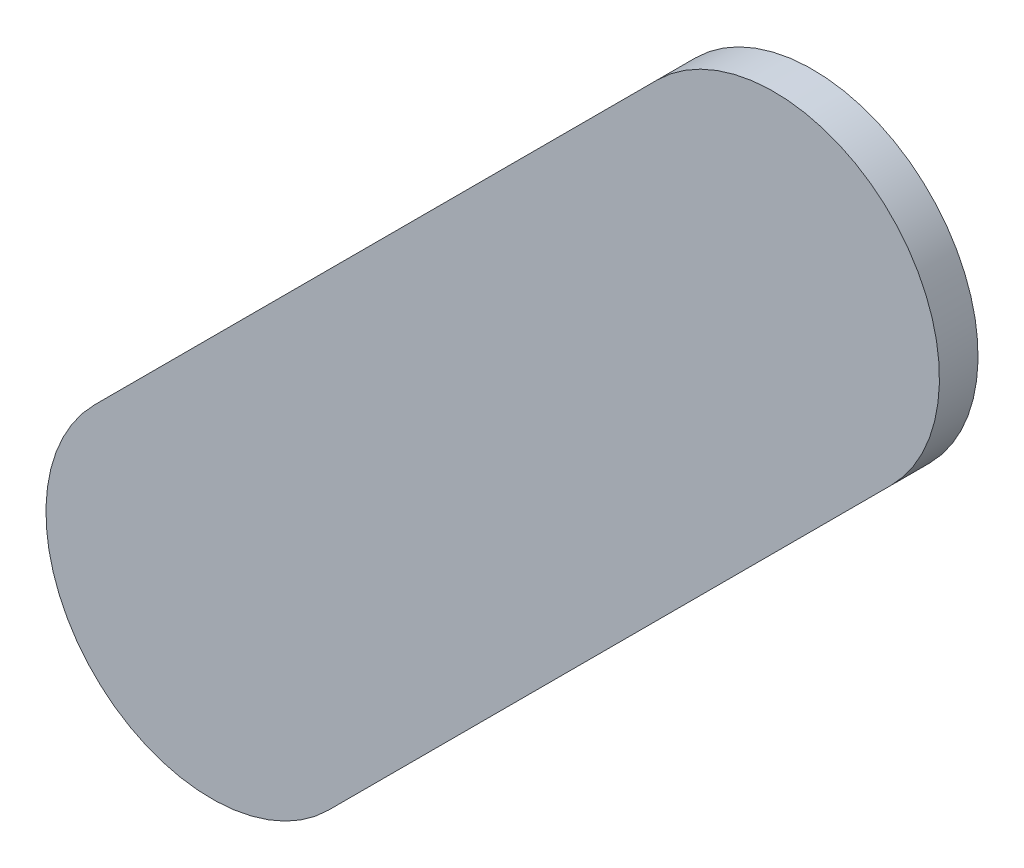
ISO-10303-21;
HEADER;
FILE_DESCRIPTION(('STEP AP214'),'2;1');
FILE_NAME('part.step','',(''),(''),'','','');
FILE_SCHEMA(('AUTOMOTIVE_DESIGN { 1 0 10303 214 1 1 1 1 }'));
ENDSEC;
DATA;
#1=APPLICATION_CONTEXT('core data for automotive mechanical design processes');
#2=APPLICATION_PROTOCOL_DEFINITION('international standard','automotive_design',2000,#1);
#3=PRODUCT_CONTEXT('',#1,'mechanical');
#4=PRODUCT('Part','Part','',(#3));
#5=PRODUCT_RELATED_PRODUCT_CATEGORY('part','',(#4));
#6=PRODUCT_DEFINITION_FORMATION('','',#4);
#7=PRODUCT_DEFINITION_CONTEXT('part definition',#1,'design');
#8=PRODUCT_DEFINITION('design','',#6,#7);
#9=PRODUCT_DEFINITION_SHAPE('','',#8);
#10=(LENGTH_UNIT() NAMED_UNIT(*) SI_UNIT(.MILLI.,.METRE.));
#11=(NAMED_UNIT(*) PLANE_ANGLE_UNIT() SI_UNIT($,.RADIAN.));
#12=(NAMED_UNIT(*) SI_UNIT($,.STERADIAN.) SOLID_ANGLE_UNIT());
#13=UNCERTAINTY_MEASURE_WITH_UNIT(LENGTH_MEASURE(1.E-05),#10,'distance_accuracy_value','');
#14=(GEOMETRIC_REPRESENTATION_CONTEXT(3) GLOBAL_UNCERTAINTY_ASSIGNED_CONTEXT((#13)) GLOBAL_UNIT_ASSIGNED_CONTEXT((#10,
#11,#12)) REPRESENTATION_CONTEXT('',''));
#15=CARTESIAN_POINT('',(0.,0.,0.));
#16=DIRECTION('',(0.,0.,1.));
#17=DIRECTION('',(1.,0.,0.));
#18=AXIS2_PLACEMENT_3D('',#15,#16,#17);
#19=CARTESIAN_POINT('',(126.393933,-71.403933,1.635));
#20=DIRECTION('',(0.,0.,1.));
#21=DIRECTION('',(1.,0.,0.));
#22=AXIS2_PLACEMENT_3D('',#19,#20,#21);
#23=PLANE('',#22);
#24=DIRECTION('',(-0.707106781186548,-0.707106781186548,0.));
#25=VECTOR('',#24,1.);
#26=CARTESIAN_POINT('',(126.393933,-71.403933,1.635));
#27=LINE('',#26,#25);
#28=CARTESIAN_POINT('',(126.393933,-71.403933,1.635));
#29=VERTEX_POINT('',#28);
#30=CARTESIAN_POINT('',(125.883933,-71.913933,1.635));
#31=VERTEX_POINT('',#30);
#32=EDGE_CURVE('E93',#29,#31,#27,.T.);
#33=ORIENTED_EDGE('',*,*,#32,.T.);
#34=CARTESIAN_POINT('',(125.9899995,-72.0199995,1.635));
#35=DIRECTION('',(0.,0.,1.));
#36=DIRECTION('',(-0.707106781186548,0.707106781186548,0.));
#37=AXIS2_PLACEMENT_3D('',#34,#35,#36);
#38=CIRCLE('',#37,0.150000682813);
#39=CARTESIAN_POINT('',(126.096066,-72.126066,1.635));
#40=VERTEX_POINT('',#39);
#41=EDGE_CURVE('E71',#31,#40,#38,.T.);
#42=ORIENTED_EDGE('',*,*,#41,.T.);
#43=DIRECTION('',(0.707106781186548,0.707106781186548,0.));
#44=VECTOR('',#43,1.);
#45=CARTESIAN_POINT('',(126.096066,-72.126066,1.635));
#46=LINE('',#45,#44);
#47=CARTESIAN_POINT('',(126.606066,-71.616066,1.635));
#48=VERTEX_POINT('',#47);
#49=EDGE_CURVE('E76',#40,#48,#46,.T.);
#50=ORIENTED_EDGE('',*,*,#49,.T.);
#51=CARTESIAN_POINT('',(126.4999995,-71.5099995,1.635));
#52=DIRECTION('',(0.,0.,1.));
#53=DIRECTION('',(0.707106781186548,-0.707106781186548,0.));
#54=AXIS2_PLACEMENT_3D('',#51,#52,#53);
#55=CIRCLE('',#54,0.150000682813);
#56=EDGE_CURVE('E11',#48,#29,#55,.T.);
#57=ORIENTED_EDGE('',*,*,#56,.T.);
#58=EDGE_LOOP('',(#33,#42,#50,#57));
#59=FACE_BOUND('',#58,.T.);
#60=ADVANCED_FACE('F17',(#59),#23,.T.);
#61=CARTESIAN_POINT('',(126.393933,-71.403933,1.6));
#62=DIRECTION('',(0.,0.,1.));
#63=DIRECTION('',(1.,0.,0.));
#64=AXIS2_PLACEMENT_3D('',#61,#62,#63);
#65=PLANE('',#64);
#66=CARTESIAN_POINT('',(126.4999995,-71.5099995,1.6));
#67=DIRECTION('',(0.,0.,1.));
#68=DIRECTION('',(0.707106781186548,-0.707106781186548,0.));
#69=AXIS2_PLACEMENT_3D('',#66,#67,#68);
#70=CIRCLE('',#69,0.150000682813);
#71=CARTESIAN_POINT('',(126.606066,-71.616066,1.6));
#72=VERTEX_POINT('',#71);
#73=CARTESIAN_POINT('',(126.393933,-71.403933,1.6));
#74=VERTEX_POINT('',#73);
#75=EDGE_CURVE('E25',#72,#74,#70,.T.);
#76=ORIENTED_EDGE('',*,*,#75,.F.);
#77=DIRECTION('',(0.707106781186548,0.707106781186548,0.));
#78=VECTOR('',#77,1.);
#79=CARTESIAN_POINT('',(126.096066,-72.126066,1.6));
#80=LINE('',#79,#78);
#81=CARTESIAN_POINT('',(126.096066,-72.126066,1.6));
#82=VERTEX_POINT('',#81);
#83=EDGE_CURVE('E60',#82,#72,#80,.T.);
#84=ORIENTED_EDGE('',*,*,#83,.F.);
#85=CARTESIAN_POINT('',(125.9899995,-72.0199995,1.6));
#86=DIRECTION('',(0.,0.,1.));
#87=DIRECTION('',(-0.707106781186548,0.707106781186548,0.));
#88=AXIS2_PLACEMENT_3D('',#85,#86,#87);
#89=CIRCLE('',#88,0.150000682813);
#90=CARTESIAN_POINT('',(125.883933,-71.913933,1.6));
#91=VERTEX_POINT('',#90);
#92=EDGE_CURVE('E65',#91,#82,#89,.T.);
#93=ORIENTED_EDGE('',*,*,#92,.F.);
#94=DIRECTION('',(-0.707106781186548,-0.707106781186548,0.));
#95=VECTOR('',#94,1.);
#96=CARTESIAN_POINT('',(126.393933,-71.403933,1.6));
#97=LINE('',#96,#95);
#98=EDGE_CURVE('E113',#74,#91,#97,.T.);
#99=ORIENTED_EDGE('',*,*,#98,.F.);
#100=EDGE_LOOP('',(#76,#84,#93,#99));
#101=FACE_BOUND('',#100,.T.);
#102=ADVANCED_FACE('F62',(#101),#65,.F.);
#103=CARTESIAN_POINT('',(126.4999995,-71.5099995,1.6));
#104=DIRECTION('',(0.,0.,-1.));
#105=DIRECTION('',(0.707106781186548,-0.707106781186548,0.));
#106=AXIS2_PLACEMENT_3D('',#103,#104,#105);
#107=CYLINDRICAL_SURFACE('',#106,0.150000682813);
#108=ORIENTED_EDGE('',*,*,#75,.T.);
#109=DIRECTION('',(0.,0.,1.));
#110=VECTOR('',#109,1.);
#111=CARTESIAN_POINT('',(126.393933,-71.403933,1.6));
#112=LINE('',#111,#110);
#113=EDGE_CURVE('E87',#74,#29,#112,.T.);
#114=ORIENTED_EDGE('',*,*,#113,.T.);
#115=ORIENTED_EDGE('',*,*,#56,.F.);
#116=DIRECTION('',(0.,0.,1.));
#117=VECTOR('',#116,1.);
#118=CARTESIAN_POINT('',(126.606066,-71.616066,1.6));
#119=LINE('',#118,#117);
#120=EDGE_CURVE('E70',#72,#48,#119,.T.);
#121=ORIENTED_EDGE('',*,*,#120,.F.);
#122=EDGE_LOOP('',(#108,#114,#115,#121));
#123=FACE_BOUND('',#122,.T.);
#124=ADVANCED_FACE('F107',(#123),#107,.T.);
#125=CARTESIAN_POINT('',(126.096066,-72.126066,1.6));
#126=DIRECTION('',(-0.707106781186548,0.707106781186548,0.));
#127=DIRECTION('',(0.,0.,1.));
#128=AXIS2_PLACEMENT_3D('',#125,#126,#127);
#129=PLANE('',#128);
#130=ORIENTED_EDGE('',*,*,#83,.T.);
#131=ORIENTED_EDGE('',*,*,#120,.T.);
#132=ORIENTED_EDGE('',*,*,#49,.F.);
#133=DIRECTION('',(0.,0.,1.));
#134=VECTOR('',#133,1.);
#135=CARTESIAN_POINT('',(126.096066,-72.126066,1.6));
#136=LINE('',#135,#134);
#137=EDGE_CURVE('E74',#82,#40,#136,.T.);
#138=ORIENTED_EDGE('',*,*,#137,.F.);
#139=EDGE_LOOP('',(#130,#131,#132,#138));
#140=FACE_BOUND('',#139,.T.);
#141=ADVANCED_FACE('F75',(#140),#129,.F.);
#142=CARTESIAN_POINT('',(125.9899995,-72.0199995,1.6));
#143=DIRECTION('',(0.,0.,-1.));
#144=DIRECTION('',(-0.707106781186548,0.707106781186548,0.));
#145=AXIS2_PLACEMENT_3D('',#142,#143,#144);
#146=CYLINDRICAL_SURFACE('',#145,0.150000682813);
#147=ORIENTED_EDGE('',*,*,#92,.T.);
#148=ORIENTED_EDGE('',*,*,#137,.T.);
#149=ORIENTED_EDGE('',*,*,#41,.F.);
#150=DIRECTION('',(0.,0.,1.));
#151=VECTOR('',#150,1.);
#152=CARTESIAN_POINT('',(125.883933,-71.913933,1.6));
#153=LINE('',#152,#151);
#154=EDGE_CURVE('E84',#91,#31,#153,.T.);
#155=ORIENTED_EDGE('',*,*,#154,.F.);
#156=EDGE_LOOP('',(#147,#148,#149,#155));
#157=FACE_BOUND('',#156,.T.);
#158=ADVANCED_FACE('F82',(#157),#146,.T.);
#159=CARTESIAN_POINT('',(126.393933,-71.403933,1.6));
#160=DIRECTION('',(0.707106781186548,-0.707106781186548,0.));
#161=DIRECTION('',(0.,0.,-1.));
#162=AXIS2_PLACEMENT_3D('',#159,#160,#161);
#163=PLANE('',#162);
#164=ORIENTED_EDGE('',*,*,#98,.T.);
#165=ORIENTED_EDGE('',*,*,#154,.T.);
#166=ORIENTED_EDGE('',*,*,#32,.F.);
#167=ORIENTED_EDGE('',*,*,#113,.F.);
#168=EDGE_LOOP('',(#164,#165,#166,#167));
#169=FACE_BOUND('',#168,.T.);
#170=ADVANCED_FACE('F112',(#169),#163,.F.);
#171=CLOSED_SHELL('',(#60,#102,#124,#141,#158,#170));
#172=MANIFOLD_SOLID_BREP('B1',#171);
#173=ADVANCED_BREP_SHAPE_REPRESENTATION('',(#18,#172),#14);
#174=SHAPE_DEFINITION_REPRESENTATION(#9,#173);
ENDSEC;
END-ISO-10303-21;
